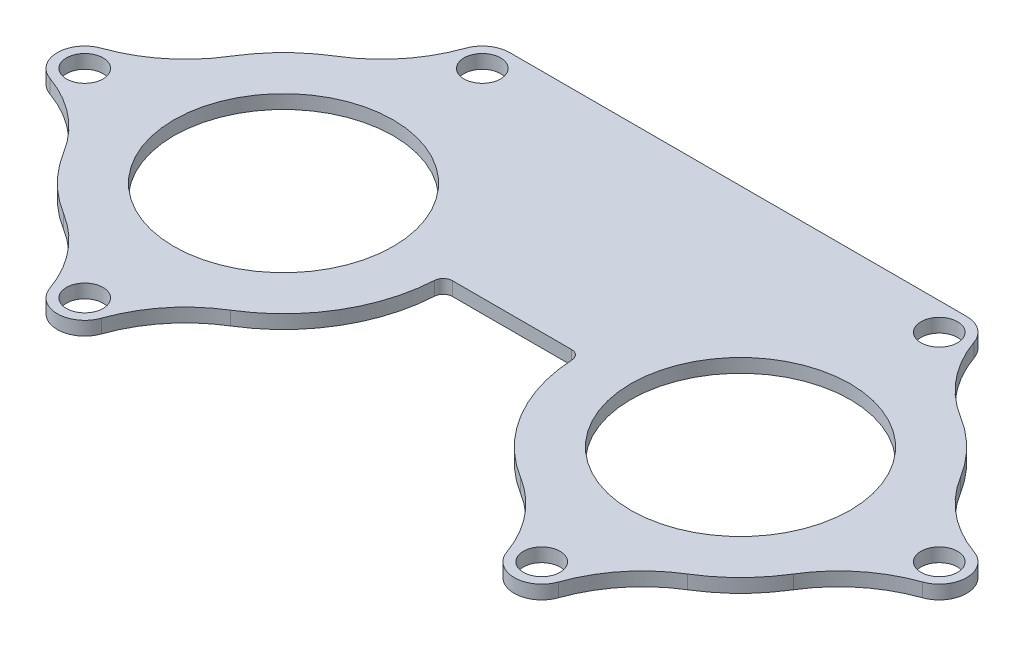
ISO-10303-21;
HEADER;
FILE_DESCRIPTION(('STEP AP214'),'2;1');
FILE_NAME('part.step','',(''),(''),'','','');
FILE_SCHEMA(('AUTOMOTIVE_DESIGN { 1 0 10303 214 1 1 1 1 }'));
ENDSEC;
DATA;
#1=APPLICATION_CONTEXT('core data for automotive mechanical design processes');
#2=APPLICATION_PROTOCOL_DEFINITION('international standard','automotive_design',2000,#1);
#3=PRODUCT_CONTEXT('',#1,'mechanical');
#4=PRODUCT('Part','Part','',(#3));
#5=PRODUCT_RELATED_PRODUCT_CATEGORY('part','',(#4));
#6=PRODUCT_DEFINITION_FORMATION('','',#4);
#7=PRODUCT_DEFINITION_CONTEXT('part definition',#1,'design');
#8=PRODUCT_DEFINITION('design','',#6,#7);
#9=PRODUCT_DEFINITION_SHAPE('','',#8);
#10=(LENGTH_UNIT() NAMED_UNIT(*) SI_UNIT(.MILLI.,.METRE.));
#11=(NAMED_UNIT(*) PLANE_ANGLE_UNIT() SI_UNIT($,.RADIAN.));
#12=(NAMED_UNIT(*) SI_UNIT($,.STERADIAN.) SOLID_ANGLE_UNIT());
#13=UNCERTAINTY_MEASURE_WITH_UNIT(LENGTH_MEASURE(1.E-05),#10,'distance_accuracy_value','');
#14=(GEOMETRIC_REPRESENTATION_CONTEXT(3) GLOBAL_UNCERTAINTY_ASSIGNED_CONTEXT((#13)) GLOBAL_UNIT_ASSIGNED_CONTEXT((#10,
#11,#12)) REPRESENTATION_CONTEXT('',''));
#15=CARTESIAN_POINT('',(0.,0.,0.));
#16=DIRECTION('',(0.,0.,1.));
#17=DIRECTION('',(1.,0.,0.));
#18=AXIS2_PLACEMENT_3D('',#15,#16,#17);
#19=CARTESIAN_POINT('',(0.,1.5,0.));
#20=DIRECTION('',(0.,-1.,0.));
#21=DIRECTION('',(0.,0.,-1.));
#22=AXIS2_PLACEMENT_3D('',#19,#20,#21);
#23=CYLINDRICAL_SURFACE('',#22,17.5);
#24=CARTESIAN_POINT('',(0.,0.,0.));
#25=DIRECTION('',(0.,1.,0.));
#26=DIRECTION('',(0.,0.,1.));
#27=AXIS2_PLACEMENT_3D('',#24,#25,#26);
#28=CIRCLE('',#27,17.5);
#29=CARTESIAN_POINT('',(9.14589665503548,0.,14.9198717948718));
#30=VERTEX_POINT('',#29);
#31=CARTESIAN_POINT('',(17.4744151909971,0.,0.945945945945946));
#32=VERTEX_POINT('',#31);
#33=EDGE_CURVE('E457',#30,#32,#28,.T.);
#34=ORIENTED_EDGE('',*,*,#33,.T.);
#35=DIRECTION('',(0.,-1.,0.));
#36=VECTOR('',#35,1.);
#37=CARTESIAN_POINT('',(17.4744151909971,1.5,0.945945945945946));
#38=LINE('',#37,#36);
#39=CARTESIAN_POINT('',(17.4744151909971,1.5,0.945945945945946));
#40=VERTEX_POINT('',#39);
#41=EDGE_CURVE('E206',#32,#40,#38,.F.);
#42=ORIENTED_EDGE('',*,*,#41,.T.);
#43=CARTESIAN_POINT('',(0.,1.5,0.));
#44=DIRECTION('',(0.,1.,0.));
#45=DIRECTION('',(0.,0.,1.));
#46=AXIS2_PLACEMENT_3D('',#43,#44,#45);
#47=CIRCLE('',#46,17.5);
#48=CARTESIAN_POINT('',(9.14589665503548,1.5,14.9198717948718));
#49=VERTEX_POINT('',#48);
#50=EDGE_CURVE('E733',#49,#40,#47,.T.);
#51=ORIENTED_EDGE('',*,*,#50,.F.);
#52=DIRECTION('',(0.,-1.,0.));
#53=VECTOR('',#52,1.);
#54=CARTESIAN_POINT('',(9.14589665503548,1.5,14.9198717948718));
#55=LINE('',#54,#53);
#56=EDGE_CURVE('E453',#49,#30,#55,.T.);
#57=ORIENTED_EDGE('',*,*,#56,.T.);
#58=EDGE_LOOP('',(#34,#42,#51,#57));
#59=FACE_BOUND('',#58,.T.);
#60=ADVANCED_FACE('F191',(#59),#23,.T.);
#61=CARTESIAN_POINT('',(0.,1.5,0.));
#62=DIRECTION('',(0.,0.,-1.));
#63=DIRECTION('',(-1.,0.,0.));
#64=AXIS2_PLACEMENT_3D('',#61,#62,#63);
#65=PLANE('',#64);
#66=DIRECTION('',(1.,0.,0.));
#67=VECTOR('',#66,1.);
#68=CARTESIAN_POINT('',(0.,0.,0.));
#69=LINE('',#68,#67);
#70=CARTESIAN_POINT('',(18.4729532019112,0.,0.));
#71=VERTEX_POINT('',#70);
#72=CARTESIAN_POINT('',(31.5270467980888,0.,0.));
#73=VERTEX_POINT('',#72);
#74=EDGE_CURVE('E460',#71,#73,#69,.T.);
#75=ORIENTED_EDGE('',*,*,#74,.T.);
#76=DIRECTION('',(0.,-1.,0.));
#77=VECTOR('',#76,1.);
#78=CARTESIAN_POINT('',(31.5270467980888,1.5,0.));
#79=LINE('',#78,#77);
#80=CARTESIAN_POINT('',(31.5270467980888,1.5,0.));
#81=VERTEX_POINT('',#80);
#82=EDGE_CURVE('E590',#73,#81,#79,.F.);
#83=ORIENTED_EDGE('',*,*,#82,.T.);
#84=DIRECTION('',(1.,0.,0.));
#85=VECTOR('',#84,1.);
#86=CARTESIAN_POINT('',(0.,1.5,0.));
#87=LINE('',#86,#85);
#88=CARTESIAN_POINT('',(18.4729532019112,1.5,0.));
#89=VERTEX_POINT('',#88);
#90=EDGE_CURVE('E389',#89,#81,#87,.T.);
#91=ORIENTED_EDGE('',*,*,#90,.F.);
#92=DIRECTION('',(0.,1.,0.));
#93=VECTOR('',#92,1.);
#94=CARTESIAN_POINT('',(18.4729532019112,0.,0.));
#95=LINE('',#94,#93);
#96=EDGE_CURVE('E587',#89,#71,#95,.F.);
#97=ORIENTED_EDGE('',*,*,#96,.T.);
#98=EDGE_LOOP('',(#75,#83,#91,#97));
#99=FACE_BOUND('',#98,.T.);
#100=ADVANCED_FACE('F600',(#99),#65,.F.);
#101=CARTESIAN_POINT('',(50.,1.5,0.));
#102=DIRECTION('',(0.,-1.,0.));
#103=DIRECTION('',(0.,0.,-1.));
#104=AXIS2_PLACEMENT_3D('',#101,#102,#103);
#105=CYLINDRICAL_SURFACE('',#104,17.5);
#106=CARTESIAN_POINT('',(50.,1.5,0.));
#107=DIRECTION('',(0.,1.,0.));
#108=DIRECTION('',(0.,0.,1.));
#109=AXIS2_PLACEMENT_3D('',#106,#107,#108);
#110=CIRCLE('',#109,17.5);
#111=CARTESIAN_POINT('',(40.8541033449645,1.5,14.9198717948718));
#112=VERTEX_POINT('',#111);
#113=CARTESIAN_POINT('',(32.5255848090029,1.5,0.945945945945946));
#114=VERTEX_POINT('',#113);
#115=EDGE_CURVE('E368',#112,#114,#110,.F.);
#116=ORIENTED_EDGE('',*,*,#115,.T.);
#117=DIRECTION('',(0.,-1.,0.));
#118=VECTOR('',#117,1.);
#119=CARTESIAN_POINT('',(32.5255848090029,1.5,0.945945945945946));
#120=LINE('',#119,#118);
#121=CARTESIAN_POINT('',(32.5255848090029,0.,0.945945945945946));
#122=VERTEX_POINT('',#121);
#123=EDGE_CURVE('E376',#114,#122,#120,.T.);
#124=ORIENTED_EDGE('',*,*,#123,.T.);
#125=CARTESIAN_POINT('',(50.,0.,0.));
#126=DIRECTION('',(0.,1.,0.));
#127=DIRECTION('',(0.,0.,1.));
#128=AXIS2_PLACEMENT_3D('',#125,#126,#127);
#129=CIRCLE('',#128,17.5);
#130=CARTESIAN_POINT('',(40.8541033449645,0.,14.9198717948718));
#131=VERTEX_POINT('',#130);
#132=EDGE_CURVE('E371',#131,#122,#129,.F.);
#133=ORIENTED_EDGE('',*,*,#132,.F.);
#134=DIRECTION('',(0.,-1.,0.));
#135=VECTOR('',#134,1.);
#136=CARTESIAN_POINT('',(40.8541033449645,1.5,14.9198717948718));
#137=LINE('',#136,#135);
#138=EDGE_CURVE('E364',#112,#131,#137,.T.);
#139=ORIENTED_EDGE('',*,*,#138,.F.);
#140=EDGE_LOOP('',(#116,#124,#133,#139));
#141=FACE_BOUND('',#140,.T.);
#142=ADVANCED_FACE('F366',(#141),#105,.T.);
#143=CARTESIAN_POINT('',(33.0147633549341,1.5,27.7083333333333));
#144=DIRECTION('',(0.,-1.,0.));
#145=DIRECTION('',(0.,0.,-1.));
#146=AXIS2_PLACEMENT_3D('',#143,#144,#145);
#147=CYLINDRICAL_SURFACE('',#146,15.);
#148=CARTESIAN_POINT('',(33.0147633549341,0.,27.7083333333333));
#149=DIRECTION('',(0.,1.,0.));
#150=DIRECTION('',(0.,0.,1.));
#151=AXIS2_PLACEMENT_3D('',#148,#149,#150);
#152=CIRCLE('',#151,15.);
#153=CARTESIAN_POINT('',(47.1691272258224,0.,22.7430555555556));
#154=VERTEX_POINT('',#153);
#155=EDGE_CURVE('E466',#154,#131,#152,.T.);
#156=ORIENTED_EDGE('',*,*,#155,.F.);
#157=DIRECTION('',(0.,-1.,0.));
#158=VECTOR('',#157,1.);
#159=CARTESIAN_POINT('',(47.1691272258224,1.5,22.7430555555556));
#160=LINE('',#159,#158);
#161=CARTESIAN_POINT('',(47.1691272258224,1.5,22.7430555555556));
#162=VERTEX_POINT('',#161);
#163=EDGE_CURVE('E377',#162,#154,#160,.T.);
#164=ORIENTED_EDGE('',*,*,#163,.F.);
#165=CARTESIAN_POINT('',(33.0147633549341,1.5,27.7083333333333));
#166=DIRECTION('',(0.,1.,0.));
#167=DIRECTION('',(0.,0.,1.));
#168=AXIS2_PLACEMENT_3D('',#165,#166,#167);
#169=CIRCLE('',#168,15.);
#170=EDGE_CURVE('E384',#162,#112,#169,.T.);
#171=ORIENTED_EDGE('',*,*,#170,.T.);
#172=ORIENTED_EDGE('',*,*,#138,.T.);
#173=EDGE_LOOP('',(#156,#164,#171,#172));
#174=FACE_BOUND('',#173,.T.);
#175=ADVANCED_FACE('F393',(#174),#147,.F.);
#176=CARTESIAN_POINT('',(50.,1.5,21.75));
#177=DIRECTION('',(0.,-1.,0.));
#178=DIRECTION('',(0.,0.,-1.));
#179=AXIS2_PLACEMENT_3D('',#176,#177,#178);
#180=CYLINDRICAL_SURFACE('',#179,3.);
#181=CARTESIAN_POINT('',(50.,0.,21.75));
#182=DIRECTION('',(0.,1.,0.));
#183=DIRECTION('',(0.,0.,1.));
#184=AXIS2_PLACEMENT_3D('',#181,#182,#183);
#185=CIRCLE('',#184,3.);
#186=CARTESIAN_POINT('',(52.8308727741777,0.,22.7430555555556));
#187=VERTEX_POINT('',#186);
#188=EDGE_CURVE('E470',#187,#154,#185,.F.);
#189=ORIENTED_EDGE('',*,*,#188,.F.);
#190=DIRECTION('',(0.,-1.,0.));
#191=VECTOR('',#190,1.);
#192=CARTESIAN_POINT('',(52.8308727741777,1.5,22.7430555555556));
#193=LINE('',#192,#191);
#194=CARTESIAN_POINT('',(52.8308727741777,1.5,22.7430555555556));
#195=VERTEX_POINT('',#194);
#196=EDGE_CURVE('E572',#195,#187,#193,.T.);
#197=ORIENTED_EDGE('',*,*,#196,.F.);
#198=CARTESIAN_POINT('',(50.,1.5,21.75));
#199=DIRECTION('',(0.,1.,0.));
#200=DIRECTION('',(0.,0.,1.));
#201=AXIS2_PLACEMENT_3D('',#198,#199,#200);
#202=CIRCLE('',#201,3.);
#203=EDGE_CURVE('E394',#195,#162,#202,.F.);
#204=ORIENTED_EDGE('',*,*,#203,.T.);
#205=ORIENTED_EDGE('',*,*,#163,.T.);
#206=EDGE_LOOP('',(#189,#197,#204,#205));
#207=FACE_BOUND('',#206,.T.);
#208=ADVANCED_FACE('F716',(#207),#180,.T.);
#209=CARTESIAN_POINT('',(66.9852366450659,1.5,27.7083333333333));
#210=DIRECTION('',(0.,-1.,0.));
#211=DIRECTION('',(0.,0.,-1.));
#212=AXIS2_PLACEMENT_3D('',#209,#210,#211);
#213=CYLINDRICAL_SURFACE('',#212,15.);
#214=CARTESIAN_POINT('',(66.9852366450659,0.,27.7083333333333));
#215=DIRECTION('',(0.,1.,0.));
#216=DIRECTION('',(0.,0.,1.));
#217=AXIS2_PLACEMENT_3D('',#214,#215,#216);
#218=CIRCLE('',#217,15.);
#219=CARTESIAN_POINT('',(59.1458966550355,0.,14.9198717948718));
#220=VERTEX_POINT('',#219);
#221=EDGE_CURVE('E473',#220,#187,#218,.T.);
#222=ORIENTED_EDGE('',*,*,#221,.F.);
#223=DIRECTION('',(0.,-1.,0.));
#224=VECTOR('',#223,1.);
#225=CARTESIAN_POINT('',(59.1458966550355,1.5,14.9198717948718));
#226=LINE('',#225,#224);
#227=CARTESIAN_POINT('',(59.1458966550355,1.5,14.9198717948718));
#228=VERTEX_POINT('',#227);
#229=EDGE_CURVE('E570',#228,#220,#226,.T.);
#230=ORIENTED_EDGE('',*,*,#229,.F.);
#231=CARTESIAN_POINT('',(66.9852366450659,1.5,27.7083333333333));
#232=DIRECTION('',(0.,1.,0.));
#233=DIRECTION('',(0.,0.,1.));
#234=AXIS2_PLACEMENT_3D('',#231,#232,#233);
#235=CIRCLE('',#234,15.);
#236=EDGE_CURVE('E396',#228,#195,#235,.T.);
#237=ORIENTED_EDGE('',*,*,#236,.T.);
#238=ORIENTED_EDGE('',*,*,#196,.T.);
#239=EDGE_LOOP('',(#222,#230,#237,#238));
#240=FACE_BOUND('',#239,.T.);
#241=ADVANCED_FACE('F713',(#240),#213,.F.);
#242=CARTESIAN_POINT('',(64.9198717948718,0.,9.14589665503548));
#243=VERTEX_POINT('',#242);
#244=EDGE_CURVE('E468',#243,#220,#129,.F.);
#245=ORIENTED_EDGE('',*,*,#244,.F.);
#246=DIRECTION('',(0.,-1.,0.));
#247=VECTOR('',#246,1.);
#248=CARTESIAN_POINT('',(64.9198717948718,1.5,9.14589665503548));
#249=LINE('',#248,#247);
#250=CARTESIAN_POINT('',(64.9198717948718,1.5,9.14589665503548));
#251=VERTEX_POINT('',#250);
#252=EDGE_CURVE('E568',#251,#243,#249,.T.);
#253=ORIENTED_EDGE('',*,*,#252,.F.);
#254=EDGE_CURVE('E392',#251,#228,#110,.F.);
#255=ORIENTED_EDGE('',*,*,#254,.T.);
#256=ORIENTED_EDGE('',*,*,#229,.T.);
#257=EDGE_LOOP('',(#245,#253,#255,#256));
#258=FACE_BOUND('',#257,.T.);
#259=ADVANCED_FACE('F701',(#258),#105,.T.);
#260=CARTESIAN_POINT('',(77.7083333333333,1.5,16.9852366450659));
#261=DIRECTION('',(0.,-1.,0.));
#262=DIRECTION('',(0.,0.,-1.));
#263=AXIS2_PLACEMENT_3D('',#260,#261,#262);
#264=CYLINDRICAL_SURFACE('',#263,15.);
#265=CARTESIAN_POINT('',(77.7083333333333,0.,16.9852366450659));
#266=DIRECTION('',(0.,1.,0.));
#267=DIRECTION('',(0.,0.,1.));
#268=AXIS2_PLACEMENT_3D('',#265,#266,#267);
#269=CIRCLE('',#268,15.);
#270=CARTESIAN_POINT('',(72.7430555555556,0.,2.83087277417765));
#271=VERTEX_POINT('',#270);
#272=EDGE_CURVE('E476',#271,#243,#269,.T.);
#273=ORIENTED_EDGE('',*,*,#272,.F.);
#274=DIRECTION('',(0.,-1.,0.));
#275=VECTOR('',#274,1.);
#276=CARTESIAN_POINT('',(72.7430555555556,1.5,2.83087277417765));
#277=LINE('',#276,#275);
#278=CARTESIAN_POINT('',(72.7430555555556,1.5,2.83087277417765));
#279=VERTEX_POINT('',#278);
#280=EDGE_CURVE('E566',#279,#271,#277,.T.);
#281=ORIENTED_EDGE('',*,*,#280,.F.);
#282=CARTESIAN_POINT('',(77.7083333333333,1.5,16.9852366450659));
#283=DIRECTION('',(0.,1.,0.));
#284=DIRECTION('',(0.,0.,1.));
#285=AXIS2_PLACEMENT_3D('',#282,#283,#284);
#286=CIRCLE('',#285,15.);
#287=EDGE_CURVE('E402',#279,#251,#286,.T.);
#288=ORIENTED_EDGE('',*,*,#287,.T.);
#289=ORIENTED_EDGE('',*,*,#252,.T.);
#290=EDGE_LOOP('',(#273,#281,#288,#289));
#291=FACE_BOUND('',#290,.T.);
#292=ADVANCED_FACE('F708',(#291),#264,.F.);
#293=CARTESIAN_POINT('',(71.75,1.5,0.));
#294=DIRECTION('',(0.,-1.,0.));
#295=DIRECTION('',(0.,0.,-1.));
#296=AXIS2_PLACEMENT_3D('',#293,#294,#295);
#297=CYLINDRICAL_SURFACE('',#296,3.00000000000001);
#298=CARTESIAN_POINT('',(71.75,0.,0.));
#299=DIRECTION('',(0.,1.,0.));
#300=DIRECTION('',(0.,0.,1.));
#301=AXIS2_PLACEMENT_3D('',#298,#299,#300);
#302=CIRCLE('',#301,3.00000000000001);
#303=CARTESIAN_POINT('',(72.7430555555556,0.,-2.83087277417765));
#304=VERTEX_POINT('',#303);
#305=EDGE_CURVE('E479',#304,#271,#302,.F.);
#306=ORIENTED_EDGE('',*,*,#305,.F.);
#307=DIRECTION('',(0.,-1.,0.));
#308=VECTOR('',#307,1.);
#309=CARTESIAN_POINT('',(72.7430555555556,1.5,-2.83087277417765));
#310=LINE('',#309,#308);
#311=CARTESIAN_POINT('',(72.7430555555556,1.5,-2.83087277417765));
#312=VERTEX_POINT('',#311);
#313=EDGE_CURVE('E564',#312,#304,#310,.T.);
#314=ORIENTED_EDGE('',*,*,#313,.F.);
#315=CARTESIAN_POINT('',(71.75,1.5,0.));
#316=DIRECTION('',(0.,1.,0.));
#317=DIRECTION('',(0.,0.,1.));
#318=AXIS2_PLACEMENT_3D('',#315,#316,#317);
#319=CIRCLE('',#318,3.00000000000001);
#320=EDGE_CURVE('E405',#312,#279,#319,.F.);
#321=ORIENTED_EDGE('',*,*,#320,.T.);
#322=ORIENTED_EDGE('',*,*,#280,.T.);
#323=EDGE_LOOP('',(#306,#314,#321,#322));
#324=FACE_BOUND('',#323,.T.);
#325=ADVANCED_FACE('F704',(#324),#297,.T.);
#326=CARTESIAN_POINT('',(77.7083333333333,1.5,-16.9852366450659));
#327=DIRECTION('',(0.,-1.,0.));
#328=DIRECTION('',(0.,0.,-1.));
#329=AXIS2_PLACEMENT_3D('',#326,#327,#328);
#330=CYLINDRICAL_SURFACE('',#329,15.);
#331=CARTESIAN_POINT('',(77.7083333333333,0.,-16.9852366450659));
#332=DIRECTION('',(0.,1.,0.));
#333=DIRECTION('',(0.,0.,1.));
#334=AXIS2_PLACEMENT_3D('',#331,#332,#333);
#335=CIRCLE('',#334,15.);
#336=CARTESIAN_POINT('',(64.9198717948718,0.,-9.14589665503548));
#337=VERTEX_POINT('',#336);
#338=EDGE_CURVE('E482',#304,#337,#335,.F.);
#339=ORIENTED_EDGE('',*,*,#338,.T.);
#340=DIRECTION('',(0.,-1.,0.));
#341=VECTOR('',#340,1.);
#342=CARTESIAN_POINT('',(64.9198717948718,1.5,-9.14589665503548));
#343=LINE('',#342,#341);
#344=CARTESIAN_POINT('',(64.9198717948718,1.5,-9.14589665503548));
#345=VERTEX_POINT('',#344);
#346=EDGE_CURVE('E562',#345,#337,#343,.T.);
#347=ORIENTED_EDGE('',*,*,#346,.F.);
#348=CARTESIAN_POINT('',(77.7083333333333,1.5,-16.9852366450659));
#349=DIRECTION('',(0.,1.,0.));
#350=DIRECTION('',(0.,0.,1.));
#351=AXIS2_PLACEMENT_3D('',#348,#349,#350);
#352=CIRCLE('',#351,15.);
#353=EDGE_CURVE('E408',#312,#345,#352,.F.);
#354=ORIENTED_EDGE('',*,*,#353,.F.);
#355=ORIENTED_EDGE('',*,*,#313,.T.);
#356=EDGE_LOOP('',(#339,#347,#354,#355));
#357=FACE_BOUND('',#356,.T.);
#358=ADVANCED_FACE('F699',(#357),#330,.F.);
#359=CARTESIAN_POINT('',(59.1458966550355,0.,-14.9198717948718));
#360=VERTEX_POINT('',#359);
#361=EDGE_CURVE('E467',#360,#337,#129,.F.);
#362=ORIENTED_EDGE('',*,*,#361,.F.);
#363=DIRECTION('',(0.,-1.,0.));
#364=VECTOR('',#363,1.);
#365=CARTESIAN_POINT('',(59.1458966550355,1.5,-14.9198717948718));
#366=LINE('',#365,#364);
#367=CARTESIAN_POINT('',(59.1458966550355,1.5,-14.9198717948718));
#368=VERTEX_POINT('',#367);
#369=EDGE_CURVE('E560',#368,#360,#366,.T.);
#370=ORIENTED_EDGE('',*,*,#369,.F.);
#371=EDGE_CURVE('E391',#368,#345,#110,.F.);
#372=ORIENTED_EDGE('',*,*,#371,.T.);
#373=ORIENTED_EDGE('',*,*,#346,.T.);
#374=EDGE_LOOP('',(#362,#370,#372,#373));
#375=FACE_BOUND('',#374,.T.);
#376=ADVANCED_FACE('F695',(#375),#105,.T.);
#377=CARTESIAN_POINT('',(66.9852366450659,1.5,-27.7083333333333));
#378=DIRECTION('',(0.,-1.,0.));
#379=DIRECTION('',(0.,0.,-1.));
#380=AXIS2_PLACEMENT_3D('',#377,#378,#379);
#381=CYLINDRICAL_SURFACE('',#380,15.);
#382=CARTESIAN_POINT('',(66.9852366450659,0.,-27.7083333333333));
#383=DIRECTION('',(0.,1.,0.));
#384=DIRECTION('',(0.,0.,1.));
#385=AXIS2_PLACEMENT_3D('',#382,#383,#384);
#386=CIRCLE('',#385,15.);
#387=CARTESIAN_POINT('',(52.8308727741777,0.,-22.7430555555556));
#388=VERTEX_POINT('',#387);
#389=EDGE_CURVE('E485',#388,#360,#386,.T.);
#390=ORIENTED_EDGE('',*,*,#389,.F.);
#391=DIRECTION('',(0.,-1.,0.));
#392=VECTOR('',#391,1.);
#393=CARTESIAN_POINT('',(52.8308727741777,1.5,-22.7430555555556));
#394=LINE('',#393,#392);
#395=CARTESIAN_POINT('',(52.8308727741777,1.5,-22.7430555555556));
#396=VERTEX_POINT('',#395);
#397=EDGE_CURVE('E558',#396,#388,#394,.T.);
#398=ORIENTED_EDGE('',*,*,#397,.F.);
#399=CARTESIAN_POINT('',(66.9852366450659,1.5,-27.7083333333333));
#400=DIRECTION('',(0.,1.,0.));
#401=DIRECTION('',(0.,0.,1.));
#402=AXIS2_PLACEMENT_3D('',#399,#400,#401);
#403=CIRCLE('',#402,15.);
#404=EDGE_CURVE('E410',#396,#368,#403,.T.);
#405=ORIENTED_EDGE('',*,*,#404,.T.);
#406=ORIENTED_EDGE('',*,*,#369,.T.);
#407=EDGE_LOOP('',(#390,#398,#405,#406));
#408=FACE_BOUND('',#407,.T.);
#409=ADVANCED_FACE('F691',(#408),#381,.F.);
#410=CARTESIAN_POINT('',(0.,1.5,-24.75));
#411=DIRECTION('',(0.,0.,-1.));
#412=DIRECTION('',(-1.,0.,0.));
#413=AXIS2_PLACEMENT_3D('',#410,#411,#412);
#414=PLANE('',#413);
#415=DIRECTION('',(1.,0.,0.));
#416=VECTOR('',#415,1.);
#417=CARTESIAN_POINT('',(0.,0.,-24.75));
#418=LINE('',#417,#416);
#419=CARTESIAN_POINT('',(0.,0.,-24.75));
#420=VERTEX_POINT('',#419);
#421=CARTESIAN_POINT('',(50.,0.,-24.75));
#422=VERTEX_POINT('',#421);
#423=EDGE_CURVE('E488',#420,#422,#418,.T.);
#424=ORIENTED_EDGE('',*,*,#423,.F.);
#425=DIRECTION('',(0.,-1.,0.));
#426=VECTOR('',#425,1.);
#427=CARTESIAN_POINT('',(0.,1.5,-24.75));
#428=LINE('',#427,#426);
#429=CARTESIAN_POINT('',(0.,1.5,-24.75));
#430=VERTEX_POINT('',#429);
#431=EDGE_CURVE('E554',#430,#420,#428,.T.);
#432=ORIENTED_EDGE('',*,*,#431,.F.);
#433=DIRECTION('',(1.,0.,0.));
#434=VECTOR('',#433,1.);
#435=CARTESIAN_POINT('',(0.,1.5,-24.75));
#436=LINE('',#435,#434);
#437=CARTESIAN_POINT('',(50.,1.5,-24.75));
#438=VERTEX_POINT('',#437);
#439=EDGE_CURVE('E413',#430,#438,#436,.T.);
#440=ORIENTED_EDGE('',*,*,#439,.T.);
#441=DIRECTION('',(0.,-1.,0.));
#442=VECTOR('',#441,1.);
#443=CARTESIAN_POINT('',(50.,1.5,-24.75));
#444=LINE('',#443,#442);
#445=EDGE_CURVE('E556',#438,#422,#444,.T.);
#446=ORIENTED_EDGE('',*,*,#445,.T.);
#447=EDGE_LOOP('',(#424,#432,#440,#446));
#448=FACE_BOUND('',#447,.T.);
#449=ADVANCED_FACE('F687',(#448),#414,.T.);
#450=CARTESIAN_POINT('',(0.,1.5,-21.75));
#451=DIRECTION('',(0.,-1.,0.));
#452=DIRECTION('',(0.,0.,-1.));
#453=AXIS2_PLACEMENT_3D('',#450,#451,#452);
#454=CYLINDRICAL_SURFACE('',#453,3.);
#455=CARTESIAN_POINT('',(0.,0.,-21.75));
#456=DIRECTION('',(0.,1.,0.));
#457=DIRECTION('',(0.,0.,1.));
#458=AXIS2_PLACEMENT_3D('',#455,#456,#457);
#459=CIRCLE('',#458,3.);
#460=CARTESIAN_POINT('',(-2.83087277417765,0.,-22.7430555555556));
#461=VERTEX_POINT('',#460);
#462=EDGE_CURVE('E491',#420,#461,#459,.T.);
#463=ORIENTED_EDGE('',*,*,#462,.T.);
#464=DIRECTION('',(0.,-1.,0.));
#465=VECTOR('',#464,1.);
#466=CARTESIAN_POINT('',(-2.83087277417765,1.5,-22.7430555555556));
#467=LINE('',#466,#465);
#468=CARTESIAN_POINT('',(-2.83087277417765,1.5,-22.7430555555556));
#469=VERTEX_POINT('',#468);
#470=EDGE_CURVE('E551',#469,#461,#467,.T.);
#471=ORIENTED_EDGE('',*,*,#470,.F.);
#472=CARTESIAN_POINT('',(0.,1.5,-21.75));
#473=DIRECTION('',(0.,1.,0.));
#474=DIRECTION('',(0.,0.,1.));
#475=AXIS2_PLACEMENT_3D('',#472,#473,#474);
#476=CIRCLE('',#475,3.);
#477=EDGE_CURVE('E416',#430,#469,#476,.T.);
#478=ORIENTED_EDGE('',*,*,#477,.F.);
#479=ORIENTED_EDGE('',*,*,#431,.T.);
#480=EDGE_LOOP('',(#463,#471,#478,#479));
#481=FACE_BOUND('',#480,.T.);
#482=ADVANCED_FACE('F683',(#481),#454,.T.);
#483=CARTESIAN_POINT('',(-16.9852366450659,1.5,-27.7083333333333));
#484=DIRECTION('',(0.,-1.,0.));
#485=DIRECTION('',(0.,0.,-1.));
#486=AXIS2_PLACEMENT_3D('',#483,#484,#485);
#487=CYLINDRICAL_SURFACE('',#486,15.);
#488=CARTESIAN_POINT('',(-16.9852366450659,0.,-27.7083333333333));
#489=DIRECTION('',(0.,1.,0.));
#490=DIRECTION('',(0.,0.,1.));
#491=AXIS2_PLACEMENT_3D('',#488,#489,#490);
#492=CIRCLE('',#491,15.);
#493=CARTESIAN_POINT('',(-9.14589665503548,0.,-14.9198717948718));
#494=VERTEX_POINT('',#493);
#495=EDGE_CURVE('E493',#461,#494,#492,.F.);
#496=ORIENTED_EDGE('',*,*,#495,.T.);
#497=DIRECTION('',(0.,-1.,0.));
#498=VECTOR('',#497,1.);
#499=CARTESIAN_POINT('',(-9.14589665503548,1.5,-14.9198717948718));
#500=LINE('',#499,#498);
#501=CARTESIAN_POINT('',(-9.14589665503548,1.5,-14.9198717948718));
#502=VERTEX_POINT('',#501);
#503=EDGE_CURVE('E548',#502,#494,#500,.T.);
#504=ORIENTED_EDGE('',*,*,#503,.F.);
#505=CARTESIAN_POINT('',(-16.9852366450659,1.5,-27.7083333333333));
#506=DIRECTION('',(0.,1.,0.));
#507=DIRECTION('',(0.,0.,1.));
#508=AXIS2_PLACEMENT_3D('',#505,#506,#507);
#509=CIRCLE('',#508,15.);
#510=EDGE_CURVE('E418',#469,#502,#509,.F.);
#511=ORIENTED_EDGE('',*,*,#510,.F.);
#512=ORIENTED_EDGE('',*,*,#470,.T.);
#513=EDGE_LOOP('',(#496,#504,#511,#512));
#514=FACE_BOUND('',#513,.T.);
#515=ADVANCED_FACE('F680',(#514),#487,.F.);
#516=CARTESIAN_POINT('',(-14.9198717948718,0.,-9.14589665503548));
#517=VERTEX_POINT('',#516);
#518=EDGE_CURVE('E462',#494,#517,#28,.T.);
#519=ORIENTED_EDGE('',*,*,#518,.T.);
#520=DIRECTION('',(0.,-1.,0.));
#521=VECTOR('',#520,1.);
#522=CARTESIAN_POINT('',(-14.9198717948718,1.5,-9.14589665503548));
#523=LINE('',#522,#521);
#524=CARTESIAN_POINT('',(-14.9198717948718,1.5,-9.14589665503548));
#525=VERTEX_POINT('',#524);
#526=EDGE_CURVE('E546',#525,#517,#523,.T.);
#527=ORIENTED_EDGE('',*,*,#526,.F.);
#528=EDGE_CURVE('E420',#502,#525,#47,.T.);
#529=ORIENTED_EDGE('',*,*,#528,.F.);
#530=ORIENTED_EDGE('',*,*,#503,.T.);
#531=EDGE_LOOP('',(#519,#527,#529,#530));
#532=FACE_BOUND('',#531,.T.);
#533=ADVANCED_FACE('F668',(#532),#23,.T.);
#534=CARTESIAN_POINT('',(-27.7083333333333,1.5,-16.9852366450659));
#535=DIRECTION('',(0.,-1.,0.));
#536=DIRECTION('',(0.,0.,-1.));
#537=AXIS2_PLACEMENT_3D('',#534,#535,#536);
#538=CYLINDRICAL_SURFACE('',#537,15.);
#539=CARTESIAN_POINT('',(-27.7083333333333,0.,-16.9852366450659));
#540=DIRECTION('',(0.,1.,0.));
#541=DIRECTION('',(0.,0.,1.));
#542=AXIS2_PLACEMENT_3D('',#539,#540,#541);
#543=CIRCLE('',#542,15.);
#544=CARTESIAN_POINT('',(-22.7430555555556,0.,-2.83087277417765));
#545=VERTEX_POINT('',#544);
#546=EDGE_CURVE('E495',#545,#517,#543,.T.);
#547=ORIENTED_EDGE('',*,*,#546,.F.);
#548=DIRECTION('',(0.,-1.,0.));
#549=VECTOR('',#548,1.);
#550=CARTESIAN_POINT('',(-22.7430555555556,1.5,-2.83087277417765));
#551=LINE('',#550,#549);
#552=CARTESIAN_POINT('',(-22.7430555555556,1.5,-2.83087277417765));
#553=VERTEX_POINT('',#552);
#554=EDGE_CURVE('E544',#553,#545,#551,.T.);
#555=ORIENTED_EDGE('',*,*,#554,.F.);
#556=CARTESIAN_POINT('',(-27.7083333333333,1.5,-16.9852366450659));
#557=DIRECTION('',(0.,1.,0.));
#558=DIRECTION('',(0.,0.,1.));
#559=AXIS2_PLACEMENT_3D('',#556,#557,#558);
#560=CIRCLE('',#559,15.);
#561=EDGE_CURVE('E421',#553,#525,#560,.T.);
#562=ORIENTED_EDGE('',*,*,#561,.T.);
#563=ORIENTED_EDGE('',*,*,#526,.T.);
#564=EDGE_LOOP('',(#547,#555,#562,#563));
#565=FACE_BOUND('',#564,.T.);
#566=ADVANCED_FACE('F675',(#565),#538,.F.);
#567=CARTESIAN_POINT('',(-21.75,1.5,0.));
#568=DIRECTION('',(0.,-1.,0.));
#569=DIRECTION('',(0.,0.,-1.));
#570=AXIS2_PLACEMENT_3D('',#567,#568,#569);
#571=CYLINDRICAL_SURFACE('',#570,3.);
#572=CARTESIAN_POINT('',(-21.75,0.,0.));
#573=DIRECTION('',(0.,1.,0.));
#574=DIRECTION('',(0.,0.,1.));
#575=AXIS2_PLACEMENT_3D('',#572,#573,#574);
#576=CIRCLE('',#575,3.);
#577=CARTESIAN_POINT('',(-22.7430555555556,0.,2.83087277417765));
#578=VERTEX_POINT('',#577);
#579=EDGE_CURVE('E498',#545,#578,#576,.T.);
#580=ORIENTED_EDGE('',*,*,#579,.T.);
#581=DIRECTION('',(0.,-1.,0.));
#582=VECTOR('',#581,1.);
#583=CARTESIAN_POINT('',(-22.7430555555556,1.5,2.83087277417765));
#584=LINE('',#583,#582);
#585=CARTESIAN_POINT('',(-22.7430555555556,1.5,2.83087277417765));
#586=VERTEX_POINT('',#585);
#587=EDGE_CURVE('E541',#586,#578,#584,.T.);
#588=ORIENTED_EDGE('',*,*,#587,.F.);
#589=CARTESIAN_POINT('',(-21.75,1.5,0.));
#590=DIRECTION('',(0.,1.,0.));
#591=DIRECTION('',(0.,0.,1.));
#592=AXIS2_PLACEMENT_3D('',#589,#590,#591);
#593=CIRCLE('',#592,3.);
#594=EDGE_CURVE('E424',#553,#586,#593,.T.);
#595=ORIENTED_EDGE('',*,*,#594,.F.);
#596=ORIENTED_EDGE('',*,*,#554,.T.);
#597=EDGE_LOOP('',(#580,#588,#595,#596));
#598=FACE_BOUND('',#597,.T.);
#599=ADVANCED_FACE('F671',(#598),#571,.T.);
#600=CARTESIAN_POINT('',(-27.7083333333333,1.5,16.9852366450659));
#601=DIRECTION('',(0.,-1.,0.));
#602=DIRECTION('',(0.,0.,-1.));
#603=AXIS2_PLACEMENT_3D('',#600,#601,#602);
#604=CYLINDRICAL_SURFACE('',#603,15.);
#605=CARTESIAN_POINT('',(-27.7083333333333,0.,16.9852366450659));
#606=DIRECTION('',(0.,1.,0.));
#607=DIRECTION('',(0.,0.,1.));
#608=AXIS2_PLACEMENT_3D('',#605,#606,#607);
#609=CIRCLE('',#608,15.);
#610=CARTESIAN_POINT('',(-14.9198717948718,0.,9.14589665503548));
#611=VERTEX_POINT('',#610);
#612=EDGE_CURVE('E500',#578,#611,#609,.F.);
#613=ORIENTED_EDGE('',*,*,#612,.T.);
#614=DIRECTION('',(0.,-1.,0.));
#615=VECTOR('',#614,1.);
#616=CARTESIAN_POINT('',(-14.9198717948718,1.5,9.14589665503548));
#617=LINE('',#616,#615);
#618=CARTESIAN_POINT('',(-14.9198717948718,1.5,9.14589665503548));
#619=VERTEX_POINT('',#618);
#620=EDGE_CURVE('E538',#619,#611,#617,.T.);
#621=ORIENTED_EDGE('',*,*,#620,.F.);
#622=CARTESIAN_POINT('',(-27.7083333333333,1.5,16.9852366450659));
#623=DIRECTION('',(0.,1.,0.));
#624=DIRECTION('',(0.,0.,1.));
#625=AXIS2_PLACEMENT_3D('',#622,#623,#624);
#626=CIRCLE('',#625,15.);
#627=EDGE_CURVE('E426',#586,#619,#626,.F.);
#628=ORIENTED_EDGE('',*,*,#627,.F.);
#629=ORIENTED_EDGE('',*,*,#587,.T.);
#630=EDGE_LOOP('',(#613,#621,#628,#629));
#631=FACE_BOUND('',#630,.T.);
#632=ADVANCED_FACE('F666',(#631),#604,.F.);
#633=CARTESIAN_POINT('',(-9.14589665503548,0.,14.9198717948718));
#634=VERTEX_POINT('',#633);
#635=EDGE_CURVE('E461',#611,#634,#28,.T.);
#636=ORIENTED_EDGE('',*,*,#635,.T.);
#637=DIRECTION('',(0.,-1.,0.));
#638=VECTOR('',#637,1.);
#639=CARTESIAN_POINT('',(-9.14589665503548,1.5,14.9198717948718));
#640=LINE('',#639,#638);
#641=CARTESIAN_POINT('',(-9.14589665503548,1.5,14.9198717948718));
#642=VERTEX_POINT('',#641);
#643=EDGE_CURVE('E535',#642,#634,#640,.T.);
#644=ORIENTED_EDGE('',*,*,#643,.F.);
#645=EDGE_CURVE('E428',#619,#642,#47,.T.);
#646=ORIENTED_EDGE('',*,*,#645,.F.);
#647=ORIENTED_EDGE('',*,*,#620,.T.);
#648=EDGE_LOOP('',(#636,#644,#646,#647));
#649=FACE_BOUND('',#648,.T.);
#650=ADVANCED_FACE('F662',(#649),#23,.T.);
#651=CARTESIAN_POINT('',(-16.9852366450659,1.5,27.7083333333333));
#652=DIRECTION('',(0.,-1.,0.));
#653=DIRECTION('',(0.,0.,-1.));
#654=AXIS2_PLACEMENT_3D('',#651,#652,#653);
#655=CYLINDRICAL_SURFACE('',#654,15.);
#656=CARTESIAN_POINT('',(-16.9852366450659,0.,27.7083333333333));
#657=DIRECTION('',(0.,1.,0.));
#658=DIRECTION('',(0.,0.,1.));
#659=AXIS2_PLACEMENT_3D('',#656,#657,#658);
#660=CIRCLE('',#659,15.);
#661=CARTESIAN_POINT('',(-2.83087277417765,0.,22.7430555555556));
#662=VERTEX_POINT('',#661);
#663=EDGE_CURVE('E502',#634,#662,#660,.F.);
#664=ORIENTED_EDGE('',*,*,#663,.T.);
#665=DIRECTION('',(0.,-1.,0.));
#666=VECTOR('',#665,1.);
#667=CARTESIAN_POINT('',(-2.83087277417765,1.5,22.7430555555556));
#668=LINE('',#667,#666);
#669=CARTESIAN_POINT('',(-2.83087277417765,1.5,22.7430555555556));
#670=VERTEX_POINT('',#669);
#671=EDGE_CURVE('E532',#670,#662,#668,.T.);
#672=ORIENTED_EDGE('',*,*,#671,.F.);
#673=CARTESIAN_POINT('',(-16.9852366450659,1.5,27.7083333333333));
#674=DIRECTION('',(0.,1.,0.));
#675=DIRECTION('',(0.,0.,1.));
#676=AXIS2_PLACEMENT_3D('',#673,#674,#675);
#677=CIRCLE('',#676,15.);
#678=EDGE_CURVE('E429',#642,#670,#677,.F.);
#679=ORIENTED_EDGE('',*,*,#678,.F.);
#680=ORIENTED_EDGE('',*,*,#643,.T.);
#681=EDGE_LOOP('',(#664,#672,#679,#680));
#682=FACE_BOUND('',#681,.T.);
#683=ADVANCED_FACE('F658',(#682),#655,.F.);
#684=CARTESIAN_POINT('',(0.,1.5,21.75));
#685=DIRECTION('',(0.,-1.,0.));
#686=DIRECTION('',(0.,0.,-1.));
#687=AXIS2_PLACEMENT_3D('',#684,#685,#686);
#688=CYLINDRICAL_SURFACE('',#687,3.);
#689=CARTESIAN_POINT('',(0.,0.,21.75));
#690=DIRECTION('',(0.,1.,0.));
#691=DIRECTION('',(0.,0.,1.));
#692=AXIS2_PLACEMENT_3D('',#689,#690,#691);
#693=CIRCLE('',#692,3.);
#694=CARTESIAN_POINT('',(2.83087277417765,0.,22.7430555555556));
#695=VERTEX_POINT('',#694);
#696=EDGE_CURVE('E504',#662,#695,#693,.T.);
#697=ORIENTED_EDGE('',*,*,#696,.T.);
#698=DIRECTION('',(0.,-1.,0.));
#699=VECTOR('',#698,1.);
#700=CARTESIAN_POINT('',(2.83087277417765,1.5,22.7430555555556));
#701=LINE('',#700,#699);
#702=CARTESIAN_POINT('',(2.83087277417765,1.5,22.7430555555556));
#703=VERTEX_POINT('',#702);
#704=EDGE_CURVE('E529',#703,#695,#701,.T.);
#705=ORIENTED_EDGE('',*,*,#704,.F.);
#706=CARTESIAN_POINT('',(0.,1.5,21.75));
#707=DIRECTION('',(0.,1.,0.));
#708=DIRECTION('',(0.,0.,1.));
#709=AXIS2_PLACEMENT_3D('',#706,#707,#708);
#710=CIRCLE('',#709,3.);
#711=EDGE_CURVE('E431',#670,#703,#710,.T.);
#712=ORIENTED_EDGE('',*,*,#711,.F.);
#713=ORIENTED_EDGE('',*,*,#671,.T.);
#714=EDGE_LOOP('',(#697,#705,#712,#713));
#715=FACE_BOUND('',#714,.T.);
#716=ADVANCED_FACE('F635',(#715),#688,.T.);
#717=CARTESIAN_POINT('',(71.75,1.5,0.));
#718=DIRECTION('',(0.,-1.,0.));
#719=DIRECTION('',(0.,0.,-1.));
#720=AXIS2_PLACEMENT_3D('',#717,#718,#719);
#721=CYLINDRICAL_SURFACE('',#720,2.);
#722=CARTESIAN_POINT('',(71.75,1.5,0.));
#723=DIRECTION('',(0.,1.,0.));
#724=DIRECTION('',(0.,0.,1.));
#725=AXIS2_PLACEMENT_3D('',#722,#723,#724);
#726=CIRCLE('',#725,2.);
#727=CARTESIAN_POINT('',(71.75,1.5,2.));
#728=VERTEX_POINT('',#727);
#729=EDGE_CURVE('E447',#728,#728,#726,.T.);
#730=ORIENTED_EDGE('',*,*,#729,.T.);
#731=EDGE_LOOP('',(#730));
#732=FACE_BOUND('',#731,.T.);
#733=CARTESIAN_POINT('',(71.75,0.,0.));
#734=DIRECTION('',(0.,1.,0.));
#735=DIRECTION('',(0.,0.,1.));
#736=AXIS2_PLACEMENT_3D('',#733,#734,#735);
#737=CIRCLE('',#736,2.);
#738=CARTESIAN_POINT('',(71.75,0.,2.));
#739=VERTEX_POINT('',#738);
#740=EDGE_CURVE('E520',#739,#739,#737,.T.);
#741=ORIENTED_EDGE('',*,*,#740,.F.);
#742=EDGE_LOOP('',(#741));
#743=FACE_BOUND('',#742,.T.);
#744=ADVANCED_FACE('F631',(#732,#743),#721,.F.);
#745=CARTESIAN_POINT('',(-21.75,1.5,0.));
#746=DIRECTION('',(0.,-1.,0.));
#747=DIRECTION('',(0.,0.,-1.));
#748=AXIS2_PLACEMENT_3D('',#745,#746,#747);
#749=CYLINDRICAL_SURFACE('',#748,2.);
#750=CARTESIAN_POINT('',(-21.75,1.5,0.));
#751=DIRECTION('',(0.,1.,0.));
#752=DIRECTION('',(0.,0.,1.));
#753=AXIS2_PLACEMENT_3D('',#750,#751,#752);
#754=CIRCLE('',#753,2.);
#755=CARTESIAN_POINT('',(-21.75,1.5,2.));
#756=VERTEX_POINT('',#755);
#757=EDGE_CURVE('E444',#756,#756,#754,.T.);
#758=ORIENTED_EDGE('',*,*,#757,.T.);
#759=EDGE_LOOP('',(#758));
#760=FACE_BOUND('',#759,.T.);
#761=CARTESIAN_POINT('',(-21.75,0.,0.));
#762=DIRECTION('',(0.,1.,0.));
#763=DIRECTION('',(0.,0.,1.));
#764=AXIS2_PLACEMENT_3D('',#761,#762,#763);
#765=CIRCLE('',#764,2.);
#766=CARTESIAN_POINT('',(-21.75,0.,2.));
#767=VERTEX_POINT('',#766);
#768=EDGE_CURVE('E517',#767,#767,#765,.T.);
#769=ORIENTED_EDGE('',*,*,#768,.F.);
#770=EDGE_LOOP('',(#769));
#771=FACE_BOUND('',#770,.T.);
#772=ADVANCED_FACE('F634',(#760,#771),#749,.F.);
#773=CARTESIAN_POINT('',(0.,1.5,-21.75));
#774=DIRECTION('',(0.,-1.,0.));
#775=DIRECTION('',(0.,0.,-1.));
#776=AXIS2_PLACEMENT_3D('',#773,#774,#775);
#777=CYLINDRICAL_SURFACE('',#776,2.);
#778=CARTESIAN_POINT('',(0.,1.5,-21.75));
#779=DIRECTION('',(0.,1.,0.));
#780=DIRECTION('',(0.,0.,1.));
#781=AXIS2_PLACEMENT_3D('',#778,#779,#780);
#782=CIRCLE('',#781,2.);
#783=CARTESIAN_POINT('',(0.,1.5,-19.75));
#784=VERTEX_POINT('',#783);
#785=EDGE_CURVE('E441',#784,#784,#782,.T.);
#786=ORIENTED_EDGE('',*,*,#785,.T.);
#787=EDGE_LOOP('',(#786));
#788=FACE_BOUND('',#787,.T.);
#789=CARTESIAN_POINT('',(0.,0.,-21.75));
#790=DIRECTION('',(0.,1.,0.));
#791=DIRECTION('',(0.,0.,1.));
#792=AXIS2_PLACEMENT_3D('',#789,#790,#791);
#793=CIRCLE('',#792,2.);
#794=CARTESIAN_POINT('',(0.,0.,-19.75));
#795=VERTEX_POINT('',#794);
#796=EDGE_CURVE('E514',#795,#795,#793,.T.);
#797=ORIENTED_EDGE('',*,*,#796,.F.);
#798=EDGE_LOOP('',(#797));
#799=FACE_BOUND('',#798,.T.);
#800=ADVANCED_FACE('F639',(#788,#799),#777,.F.);
#801=CARTESIAN_POINT('',(50.,1.5,0.));
#802=DIRECTION('',(0.,-1.,0.));
#803=DIRECTION('',(0.,0.,-1.));
#804=AXIS2_PLACEMENT_3D('',#801,#802,#803);
#805=CYLINDRICAL_SURFACE('',#804,12.);
#806=CARTESIAN_POINT('',(50.,1.5,0.));
#807=DIRECTION('',(0.,1.,0.));
#808=DIRECTION('',(0.,0.,1.));
#809=AXIS2_PLACEMENT_3D('',#806,#807,#808);
#810=CIRCLE('',#809,12.);
#811=CARTESIAN_POINT('',(50.,1.5,12.));
#812=VERTEX_POINT('',#811);
#813=EDGE_CURVE('E438',#812,#812,#810,.F.);
#814=ORIENTED_EDGE('',*,*,#813,.F.);
#815=EDGE_LOOP('',(#814));
#816=FACE_BOUND('',#815,.T.);
#817=CARTESIAN_POINT('',(50.,0.,0.));
#818=DIRECTION('',(0.,1.,0.));
#819=DIRECTION('',(0.,0.,1.));
#820=AXIS2_PLACEMENT_3D('',#817,#818,#819);
#821=CIRCLE('',#820,12.);
#822=CARTESIAN_POINT('',(50.,0.,12.));
#823=VERTEX_POINT('',#822);
#824=EDGE_CURVE('E511',#823,#823,#821,.F.);
#825=ORIENTED_EDGE('',*,*,#824,.T.);
#826=EDGE_LOOP('',(#825));
#827=FACE_BOUND('',#826,.T.);
#828=ADVANCED_FACE('F643',(#816,#827),#805,.F.);
#829=CARTESIAN_POINT('',(0.,1.5,21.75));
#830=DIRECTION('',(0.,-1.,0.));
#831=DIRECTION('',(0.,0.,-1.));
#832=AXIS2_PLACEMENT_3D('',#829,#830,#831);
#833=CYLINDRICAL_SURFACE('',#832,2.);
#834=CARTESIAN_POINT('',(0.,1.5,21.75));
#835=DIRECTION('',(0.,1.,0.));
#836=DIRECTION('',(0.,0.,1.));
#837=AXIS2_PLACEMENT_3D('',#834,#835,#836);
#838=CIRCLE('',#837,2.);
#839=CARTESIAN_POINT('',(0.,1.5,23.75));
#840=VERTEX_POINT('',#839);
#841=EDGE_CURVE('E435',#840,#840,#838,.T.);
#842=ORIENTED_EDGE('',*,*,#841,.T.);
#843=EDGE_LOOP('',(#842));
#844=FACE_BOUND('',#843,.T.);
#845=CARTESIAN_POINT('',(0.,0.,21.75));
#846=DIRECTION('',(0.,1.,0.));
#847=DIRECTION('',(0.,0.,1.));
#848=AXIS2_PLACEMENT_3D('',#845,#846,#847);
#849=CIRCLE('',#848,2.);
#850=CARTESIAN_POINT('',(0.,0.,23.75));
#851=VERTEX_POINT('',#850);
#852=EDGE_CURVE('E508',#851,#851,#849,.T.);
#853=ORIENTED_EDGE('',*,*,#852,.F.);
#854=EDGE_LOOP('',(#853));
#855=FACE_BOUND('',#854,.T.);
#856=ADVANCED_FACE('F647',(#844,#855),#833,.F.);
#857=CARTESIAN_POINT('',(16.9852366450659,1.5,27.7083333333333));
#858=DIRECTION('',(0.,-1.,0.));
#859=DIRECTION('',(0.,0.,-1.));
#860=AXIS2_PLACEMENT_3D('',#857,#858,#859);
#861=CYLINDRICAL_SURFACE('',#860,15.);
#862=CARTESIAN_POINT('',(16.9852366450659,0.,27.7083333333333));
#863=DIRECTION('',(0.,1.,0.));
#864=DIRECTION('',(0.,0.,1.));
#865=AXIS2_PLACEMENT_3D('',#862,#863,#864);
#866=CIRCLE('',#865,15.);
#867=EDGE_CURVE('E506',#695,#30,#866,.F.);
#868=ORIENTED_EDGE('',*,*,#867,.T.);
#869=ORIENTED_EDGE('',*,*,#56,.F.);
#870=CARTESIAN_POINT('',(16.9852366450659,1.5,27.7083333333333));
#871=DIRECTION('',(0.,1.,0.));
#872=DIRECTION('',(0.,0.,1.));
#873=AXIS2_PLACEMENT_3D('',#870,#871,#872);
#874=CIRCLE('',#873,15.);
#875=EDGE_CURVE('E433',#703,#49,#874,.F.);
#876=ORIENTED_EDGE('',*,*,#875,.F.);
#877=ORIENTED_EDGE('',*,*,#704,.T.);
#878=EDGE_LOOP('',(#868,#869,#876,#877));
#879=FACE_BOUND('',#878,.T.);
#880=ADVANCED_FACE('F651',(#879),#861,.F.);
#881=CARTESIAN_POINT('',(0.,1.5,0.));
#882=DIRECTION('',(0.,-1.,0.));
#883=DIRECTION('',(0.,0.,-1.));
#884=AXIS2_PLACEMENT_3D('',#881,#882,#883);
#885=CYLINDRICAL_SURFACE('',#884,12.);
#886=CARTESIAN_POINT('',(0.,1.5,0.));
#887=DIRECTION('',(0.,1.,0.));
#888=DIRECTION('',(0.,0.,1.));
#889=AXIS2_PLACEMENT_3D('',#886,#887,#888);
#890=CIRCLE('',#889,12.);
#891=CARTESIAN_POINT('',(0.,1.5,12.));
#892=VERTEX_POINT('',#891);
#893=EDGE_CURVE('E526',#892,#892,#890,.T.);
#894=ORIENTED_EDGE('',*,*,#893,.T.);
#895=EDGE_LOOP('',(#894));
#896=FACE_BOUND('',#895,.T.);
#897=CARTESIAN_POINT('',(0.,0.,0.));
#898=DIRECTION('',(0.,1.,0.));
#899=DIRECTION('',(0.,0.,1.));
#900=AXIS2_PLACEMENT_3D('',#897,#898,#899);
#901=CIRCLE('',#900,12.);
#902=CARTESIAN_POINT('',(0.,0.,12.));
#903=VERTEX_POINT('',#902);
#904=EDGE_CURVE('E454',#903,#903,#901,.T.);
#905=ORIENTED_EDGE('',*,*,#904,.F.);
#906=EDGE_LOOP('',(#905));
#907=FACE_BOUND('',#906,.T.);
#908=ADVANCED_FACE('F629',(#896,#907),#885,.F.);
#909=CARTESIAN_POINT('',(50.,1.5,21.75));
#910=DIRECTION('',(0.,-1.,0.));
#911=DIRECTION('',(0.,0.,-1.));
#912=AXIS2_PLACEMENT_3D('',#909,#910,#911);
#913=CYLINDRICAL_SURFACE('',#912,2.);
#914=CARTESIAN_POINT('',(50.,1.5,21.75));
#915=DIRECTION('',(0.,1.,0.));
#916=DIRECTION('',(0.,0.,1.));
#917=AXIS2_PLACEMENT_3D('',#914,#915,#916);
#918=CIRCLE('',#917,2.);
#919=CARTESIAN_POINT('',(50.,1.5,23.75));
#920=VERTEX_POINT('',#919);
#921=EDGE_CURVE('E450',#920,#920,#918,.T.);
#922=ORIENTED_EDGE('',*,*,#921,.T.);
#923=EDGE_LOOP('',(#922));
#924=FACE_BOUND('',#923,.T.);
#925=CARTESIAN_POINT('',(50.,0.,21.75));
#926=DIRECTION('',(0.,1.,0.));
#927=DIRECTION('',(0.,0.,1.));
#928=AXIS2_PLACEMENT_3D('',#925,#926,#927);
#929=CIRCLE('',#928,2.);
#930=CARTESIAN_POINT('',(50.,0.,23.75));
#931=VERTEX_POINT('',#930);
#932=EDGE_CURVE('E523',#931,#931,#929,.T.);
#933=ORIENTED_EDGE('',*,*,#932,.F.);
#934=EDGE_LOOP('',(#933));
#935=FACE_BOUND('',#934,.T.);
#936=ADVANCED_FACE('F623',(#924,#935),#913,.F.);
#937=CARTESIAN_POINT('',(0.,1.5,0.));
#938=DIRECTION('',(0.,1.,0.));
#939=DIRECTION('',(0.,0.,1.));
#940=AXIS2_PLACEMENT_3D('',#937,#938,#939);
#941=PLANE('',#940);
#942=ORIENTED_EDGE('',*,*,#893,.F.);
#943=EDGE_LOOP('',(#942));
#944=FACE_BOUND('',#943,.T.);
#945=ORIENTED_EDGE('',*,*,#50,.T.);
#946=CARTESIAN_POINT('',(18.4729532019112,1.5,1.));
#947=DIRECTION('',(0.,1.,0.));
#948=DIRECTION('',(0.,0.,1.));
#949=AXIS2_PLACEMENT_3D('',#946,#947,#948);
#950=CIRCLE('',#949,1.);
#951=EDGE_CURVE('E12',#40,#89,#950,.F.);
#952=ORIENTED_EDGE('',*,*,#951,.T.);
#953=ORIENTED_EDGE('',*,*,#90,.T.);
#954=CARTESIAN_POINT('',(31.5270467980888,1.5,1.));
#955=DIRECTION('',(0.,1.,0.));
#956=DIRECTION('',(0.,0.,1.));
#957=AXIS2_PLACEMENT_3D('',#954,#955,#956);
#958=CIRCLE('',#957,1.);
#959=EDGE_CURVE('E388',#81,#114,#958,.F.);
#960=ORIENTED_EDGE('',*,*,#959,.T.);
#961=ORIENTED_EDGE('',*,*,#115,.F.);
#962=ORIENTED_EDGE('',*,*,#170,.F.);
#963=ORIENTED_EDGE('',*,*,#203,.F.);
#964=ORIENTED_EDGE('',*,*,#236,.F.);
#965=ORIENTED_EDGE('',*,*,#254,.F.);
#966=ORIENTED_EDGE('',*,*,#287,.F.);
#967=ORIENTED_EDGE('',*,*,#320,.F.);
#968=ORIENTED_EDGE('',*,*,#353,.T.);
#969=ORIENTED_EDGE('',*,*,#371,.F.);
#970=ORIENTED_EDGE('',*,*,#404,.F.);
#971=CARTESIAN_POINT('',(50.,1.5,-21.75));
#972=DIRECTION('',(0.,-1.,0.));
#973=DIRECTION('',(0.,0.,-1.));
#974=AXIS2_PLACEMENT_3D('',#971,#972,#973);
#975=CIRCLE('',#974,3.);
#976=EDGE_CURVE('E458',#438,#396,#975,.T.);
#977=ORIENTED_EDGE('',*,*,#976,.F.);
#978=ORIENTED_EDGE('',*,*,#439,.F.);
#979=ORIENTED_EDGE('',*,*,#477,.T.);
#980=ORIENTED_EDGE('',*,*,#510,.T.);
#981=ORIENTED_EDGE('',*,*,#528,.T.);
#982=ORIENTED_EDGE('',*,*,#561,.F.);
#983=ORIENTED_EDGE('',*,*,#594,.T.);
#984=ORIENTED_EDGE('',*,*,#627,.T.);
#985=ORIENTED_EDGE('',*,*,#645,.T.);
#986=ORIENTED_EDGE('',*,*,#678,.T.);
#987=ORIENTED_EDGE('',*,*,#711,.T.);
#988=ORIENTED_EDGE('',*,*,#875,.T.);
#989=EDGE_LOOP('',(#945,#952,#953,#960,#961,#962,#963,#964,#965,#966,#967,#968,#969,#970,#977,
#978,#979,#980,#981,#982,#983,#984,#985,#986,#987,#988));
#990=FACE_BOUND('',#989,.T.);
#991=ORIENTED_EDGE('',*,*,#841,.F.);
#992=EDGE_LOOP('',(#991));
#993=FACE_BOUND('',#992,.T.);
#994=ORIENTED_EDGE('',*,*,#813,.T.);
#995=EDGE_LOOP('',(#994));
#996=FACE_BOUND('',#995,.T.);
#997=ORIENTED_EDGE('',*,*,#785,.F.);
#998=EDGE_LOOP('',(#997));
#999=FACE_BOUND('',#998,.T.);
#1000=ORIENTED_EDGE('',*,*,#757,.F.);
#1001=EDGE_LOOP('',(#1000));
#1002=FACE_BOUND('',#1001,.T.);
#1003=ORIENTED_EDGE('',*,*,#729,.F.);
#1004=EDGE_LOOP('',(#1003));
#1005=FACE_BOUND('',#1004,.T.);
#1006=ORIENTED_EDGE('',*,*,#921,.F.);
#1007=EDGE_LOOP('',(#1006));
#1008=FACE_BOUND('',#1007,.T.);
#1009=CARTESIAN_POINT('',(50.,1.5,-21.75));
#1010=DIRECTION('',(0.,1.,0.));
#1011=DIRECTION('',(0.,0.,1.));
#1012=AXIS2_PLACEMENT_3D('',#1009,#1010,#1011);
#1013=CIRCLE('',#1012,2.);
#1014=CARTESIAN_POINT('',(50.,1.5,-19.75));
#1015=VERTEX_POINT('',#1014);
#1016=EDGE_CURVE('E575',#1015,#1015,#1013,.T.);
#1017=ORIENTED_EDGE('',*,*,#1016,.F.);
#1018=EDGE_LOOP('',(#1017));
#1019=FACE_BOUND('',#1018,.T.);
#1020=ADVANCED_FACE('F381',(#944,#990,#993,#996,#999,#1002,#1005,#1008,#1019),#941,.T.);
#1021=CARTESIAN_POINT('',(0.,0.,0.));
#1022=DIRECTION('',(0.,1.,0.));
#1023=DIRECTION('',(0.,0.,1.));
#1024=AXIS2_PLACEMENT_3D('',#1021,#1022,#1023);
#1025=PLANE('',#1024);
#1026=ORIENTED_EDGE('',*,*,#904,.T.);
#1027=EDGE_LOOP('',(#1026));
#1028=FACE_BOUND('',#1027,.T.);
#1029=ORIENTED_EDGE('',*,*,#33,.F.);
#1030=ORIENTED_EDGE('',*,*,#867,.F.);
#1031=ORIENTED_EDGE('',*,*,#696,.F.);
#1032=ORIENTED_EDGE('',*,*,#663,.F.);
#1033=ORIENTED_EDGE('',*,*,#635,.F.);
#1034=ORIENTED_EDGE('',*,*,#612,.F.);
#1035=ORIENTED_EDGE('',*,*,#579,.F.);
#1036=ORIENTED_EDGE('',*,*,#546,.T.);
#1037=ORIENTED_EDGE('',*,*,#518,.F.);
#1038=ORIENTED_EDGE('',*,*,#495,.F.);
#1039=ORIENTED_EDGE('',*,*,#462,.F.);
#1040=ORIENTED_EDGE('',*,*,#423,.T.);
#1041=CARTESIAN_POINT('',(50.,0.,-21.75));
#1042=DIRECTION('',(0.,-1.,0.));
#1043=DIRECTION('',(0.,0.,-1.));
#1044=AXIS2_PLACEMENT_3D('',#1041,#1042,#1043);
#1045=CIRCLE('',#1044,3.);
#1046=EDGE_CURVE('E578',#422,#388,#1045,.T.);
#1047=ORIENTED_EDGE('',*,*,#1046,.T.);
#1048=ORIENTED_EDGE('',*,*,#389,.T.);
#1049=ORIENTED_EDGE('',*,*,#361,.T.);
#1050=ORIENTED_EDGE('',*,*,#338,.F.);
#1051=ORIENTED_EDGE('',*,*,#305,.T.);
#1052=ORIENTED_EDGE('',*,*,#272,.T.);
#1053=ORIENTED_EDGE('',*,*,#244,.T.);
#1054=ORIENTED_EDGE('',*,*,#221,.T.);
#1055=ORIENTED_EDGE('',*,*,#188,.T.);
#1056=ORIENTED_EDGE('',*,*,#155,.T.);
#1057=ORIENTED_EDGE('',*,*,#132,.T.);
#1058=CARTESIAN_POINT('',(31.5270467980888,0.,1.));
#1059=DIRECTION('',(0.,1.,0.));
#1060=DIRECTION('',(0.,0.,1.));
#1061=AXIS2_PLACEMENT_3D('',#1058,#1059,#1060);
#1062=CIRCLE('',#1061,1.);
#1063=EDGE_CURVE('E593',#122,#73,#1062,.T.);
#1064=ORIENTED_EDGE('',*,*,#1063,.T.);
#1065=ORIENTED_EDGE('',*,*,#74,.F.);
#1066=CARTESIAN_POINT('',(18.4729532019112,0.,1.));
#1067=DIRECTION('',(0.,1.,0.));
#1068=DIRECTION('',(0.,0.,1.));
#1069=AXIS2_PLACEMENT_3D('',#1066,#1067,#1068);
#1070=CIRCLE('',#1069,1.);
#1071=EDGE_CURVE('E199',#71,#32,#1070,.T.);
#1072=ORIENTED_EDGE('',*,*,#1071,.T.);
#1073=EDGE_LOOP('',(#1029,#1030,#1031,#1032,#1033,#1034,#1035,#1036,#1037,#1038,#1039,#1040,
#1047,#1048,#1049,#1050,#1051,#1052,#1053,#1054,#1055,#1056,#1057,#1064,#1065,#1072));
#1074=FACE_BOUND('',#1073,.T.);
#1075=ORIENTED_EDGE('',*,*,#852,.T.);
#1076=EDGE_LOOP('',(#1075));
#1077=FACE_BOUND('',#1076,.T.);
#1078=ORIENTED_EDGE('',*,*,#824,.F.);
#1079=EDGE_LOOP('',(#1078));
#1080=FACE_BOUND('',#1079,.T.);
#1081=ORIENTED_EDGE('',*,*,#796,.T.);
#1082=EDGE_LOOP('',(#1081));
#1083=FACE_BOUND('',#1082,.T.);
#1084=ORIENTED_EDGE('',*,*,#768,.T.);
#1085=EDGE_LOOP('',(#1084));
#1086=FACE_BOUND('',#1085,.T.);
#1087=ORIENTED_EDGE('',*,*,#740,.T.);
#1088=EDGE_LOOP('',(#1087));
#1089=FACE_BOUND('',#1088,.T.);
#1090=ORIENTED_EDGE('',*,*,#932,.T.);
#1091=EDGE_LOOP('',(#1090));
#1092=FACE_BOUND('',#1091,.T.);
#1093=CARTESIAN_POINT('',(50.,0.,-21.75));
#1094=DIRECTION('',(0.,1.,0.));
#1095=DIRECTION('',(0.,0.,1.));
#1096=AXIS2_PLACEMENT_3D('',#1093,#1094,#1095);
#1097=CIRCLE('',#1096,2.);
#1098=CARTESIAN_POINT('',(50.,0.,-19.75));
#1099=VERTEX_POINT('',#1098);
#1100=EDGE_CURVE('E579',#1099,#1099,#1097,.T.);
#1101=ORIENTED_EDGE('',*,*,#1100,.T.);
#1102=EDGE_LOOP('',(#1101));
#1103=FACE_BOUND('',#1102,.T.);
#1104=ADVANCED_FACE('F595',(#1028,#1074,#1077,#1080,#1083,#1086,#1089,#1092,#1103),#1025,.F.);
#1105=CARTESIAN_POINT('',(50.,1.5,-21.75));
#1106=DIRECTION('',(0.,-1.,0.));
#1107=DIRECTION('',(0.,0.,-1.));
#1108=AXIS2_PLACEMENT_3D('',#1105,#1106,#1107);
#1109=CYLINDRICAL_SURFACE('',#1108,2.);
#1110=ORIENTED_EDGE('',*,*,#1016,.T.);
#1111=EDGE_LOOP('',(#1110));
#1112=FACE_BOUND('',#1111,.T.);
#1113=ORIENTED_EDGE('',*,*,#1100,.F.);
#1114=EDGE_LOOP('',(#1113));
#1115=FACE_BOUND('',#1114,.T.);
#1116=ADVANCED_FACE('F611',(#1112,#1115),#1109,.F.);
#1117=CARTESIAN_POINT('',(50.,1.5,-21.75));
#1118=DIRECTION('',(0.,-1.,0.));
#1119=DIRECTION('',(0.,0.,-1.));
#1120=AXIS2_PLACEMENT_3D('',#1117,#1118,#1119);
#1121=CYLINDRICAL_SURFACE('',#1120,3.);
#1122=ORIENTED_EDGE('',*,*,#976,.T.);
#1123=ORIENTED_EDGE('',*,*,#397,.T.);
#1124=ORIENTED_EDGE('',*,*,#1046,.F.);
#1125=ORIENTED_EDGE('',*,*,#445,.F.);
#1126=EDGE_LOOP('',(#1122,#1123,#1124,#1125));
#1127=FACE_BOUND('',#1126,.T.);
#1128=ADVANCED_FACE('F605',(#1127),#1121,.T.);
#1129=CARTESIAN_POINT('',(31.5270467980888,1.5,1.));
#1130=DIRECTION('',(0.,-1.,0.));
#1131=DIRECTION('',(0.,0.,-1.));
#1132=AXIS2_PLACEMENT_3D('',#1129,#1130,#1131);
#1133=CYLINDRICAL_SURFACE('',#1132,1.);
#1134=ORIENTED_EDGE('',*,*,#959,.F.);
#1135=ORIENTED_EDGE('',*,*,#82,.F.);
#1136=ORIENTED_EDGE('',*,*,#1063,.F.);
#1137=ORIENTED_EDGE('',*,*,#123,.F.);
#1138=EDGE_LOOP('',(#1134,#1135,#1136,#1137));
#1139=FACE_BOUND('',#1138,.T.);
#1140=ADVANCED_FACE('F603',(#1139),#1133,.F.);
#1141=CARTESIAN_POINT('',(18.4729532019112,1.5,1.));
#1142=DIRECTION('',(0.,-1.,0.));
#1143=DIRECTION('',(0.,0.,-1.));
#1144=AXIS2_PLACEMENT_3D('',#1141,#1142,#1143);
#1145=CYLINDRICAL_SURFACE('',#1144,1.);
#1146=ORIENTED_EDGE('',*,*,#951,.F.);
#1147=ORIENTED_EDGE('',*,*,#41,.F.);
#1148=ORIENTED_EDGE('',*,*,#1071,.F.);
#1149=ORIENTED_EDGE('',*,*,#96,.F.);
#1150=EDGE_LOOP('',(#1146,#1147,#1148,#1149));
#1151=FACE_BOUND('',#1150,.T.);
#1152=ADVANCED_FACE('F193',(#1151),#1145,.F.);
#1153=CLOSED_SHELL('',(#60,#100,#142,#175,#208,#241,#259,#292,#325,#358,#376,#409,#449,#482,
#515,#533,#566,#599,#632,#650,#683,#716,#744,#772,#800,#828,#856,#880,#908,#936,#1020,#1104,
#1116,#1128,#1140,#1152));
#1154=MANIFOLD_SOLID_BREP('B2',#1153);
#1155=ADVANCED_BREP_SHAPE_REPRESENTATION('',(#18,#1154),#14);
#1156=SHAPE_DEFINITION_REPRESENTATION(#9,#1155);
ENDSEC;
END-ISO-10303-21;
